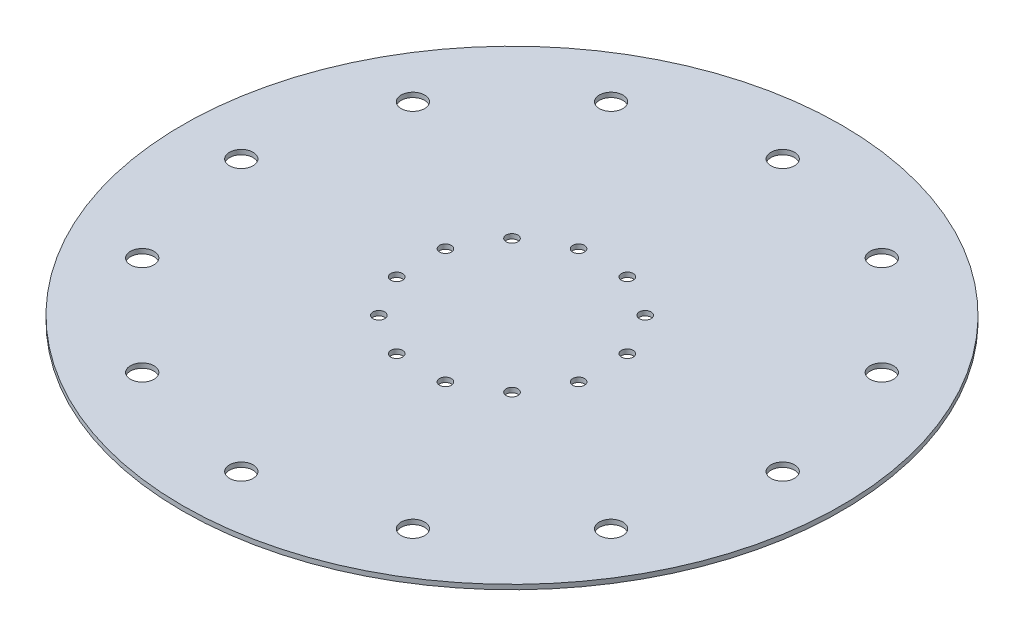
ISO-10303-21;
HEADER;
FILE_DESCRIPTION(('STEP AP214'),'2;1');
FILE_NAME('part.step','',(''),(''),'','','');
FILE_SCHEMA(('AUTOMOTIVE_DESIGN { 1 0 10303 214 1 1 1 1 }'));
ENDSEC;
DATA;
#1=APPLICATION_CONTEXT('core data for automotive mechanical design processes');
#2=APPLICATION_PROTOCOL_DEFINITION('international standard','automotive_design',2000,#1);
#3=PRODUCT_CONTEXT('',#1,'mechanical');
#4=PRODUCT('Part','Part','',(#3));
#5=PRODUCT_RELATED_PRODUCT_CATEGORY('part','',(#4));
#6=PRODUCT_DEFINITION_FORMATION('','',#4);
#7=PRODUCT_DEFINITION_CONTEXT('part definition',#1,'design');
#8=PRODUCT_DEFINITION('design','',#6,#7);
#9=PRODUCT_DEFINITION_SHAPE('','',#8);
#10=(LENGTH_UNIT() NAMED_UNIT(*) SI_UNIT(.MILLI.,.METRE.));
#11=(NAMED_UNIT(*) PLANE_ANGLE_UNIT() SI_UNIT($,.RADIAN.));
#12=(NAMED_UNIT(*) SI_UNIT($,.STERADIAN.) SOLID_ANGLE_UNIT());
#13=UNCERTAINTY_MEASURE_WITH_UNIT(LENGTH_MEASURE(1.E-05),#10,'distance_accuracy_value','');
#14=(GEOMETRIC_REPRESENTATION_CONTEXT(3) GLOBAL_UNCERTAINTY_ASSIGNED_CONTEXT((#13)) GLOBAL_UNIT_ASSIGNED_CONTEXT((#10,
#11,#12)) REPRESENTATION_CONTEXT('',''));
#15=CARTESIAN_POINT('',(0.,0.,0.));
#16=DIRECTION('',(0.,0.,1.));
#17=DIRECTION('',(1.,0.,0.));
#18=AXIS2_PLACEMENT_3D('',#15,#16,#17);
#19=CARTESIAN_POINT('',(0.,2.,0.));
#20=DIRECTION('',(0.,1.,0.));
#21=DIRECTION('',(0.,0.,1.));
#22=AXIS2_PLACEMENT_3D('',#19,#20,#21);
#23=PLANE('',#22);
#24=CARTESIAN_POINT('',(10.3527618041007,2.,38.6370330515628));
#25=DIRECTION('',(0.,1.,0.));
#26=DIRECTION('',(0.,0.,1.));
#27=AXIS2_PLACEMENT_3D('',#24,#25,#26);
#28=CIRCLE('',#27,2.5);
#29=CARTESIAN_POINT('',(10.3527618041007,2.,41.1370330515628));
#30=VERTEX_POINT('',#29);
#31=EDGE_CURVE('E177',#30,#30,#28,.T.);
#32=ORIENTED_EDGE('',*,*,#31,.F.);
#33=EDGE_LOOP('',(#32));
#34=FACE_BOUND('',#33,.T.);
#35=CARTESIAN_POINT('',(28.2842712474621,2.,28.2842712474617));
#36=DIRECTION('',(0.,1.,0.));
#37=DIRECTION('',(0.,0.,1.));
#38=AXIS2_PLACEMENT_3D('',#35,#36,#37);
#39=CIRCLE('',#38,2.50000000000001);
#40=CARTESIAN_POINT('',(28.2842712474621,2.,30.7842712474617));
#41=VERTEX_POINT('',#40);
#42=EDGE_CURVE('E165',#41,#41,#39,.T.);
#43=ORIENTED_EDGE('',*,*,#42,.F.);
#44=EDGE_LOOP('',(#43));
#45=FACE_BOUND('',#44,.T.);
#46=CARTESIAN_POINT('',(28.2842712474621,2.,-28.2842712474617));
#47=DIRECTION('',(0.,1.,0.));
#48=DIRECTION('',(0.,0.,-1.));
#49=AXIS2_PLACEMENT_3D('',#46,#47,#48);
#50=CIRCLE('',#49,2.50000000000001);
#51=CARTESIAN_POINT('',(28.2842712474621,2.,-30.7842712474617));
#52=VERTEX_POINT('',#51);
#53=EDGE_CURVE('E153',#52,#52,#50,.T.);
#54=ORIENTED_EDGE('',*,*,#53,.F.);
#55=EDGE_LOOP('',(#54));
#56=FACE_BOUND('',#55,.T.);
#57=CARTESIAN_POINT('',(38.6370330515627,2.,-10.3527618041009));
#58=DIRECTION('',(0.,1.,0.));
#59=DIRECTION('',(0.,0.,-1.));
#60=AXIS2_PLACEMENT_3D('',#57,#58,#59);
#61=CIRCLE('',#60,2.5);
#62=CARTESIAN_POINT('',(38.6370330515627,2.,-12.8527618041009));
#63=VERTEX_POINT('',#62);
#64=EDGE_CURVE('E141',#63,#63,#61,.T.);
#65=ORIENTED_EDGE('',*,*,#64,.F.);
#66=EDGE_LOOP('',(#65));
#67=FACE_BOUND('',#66,.T.);
#68=CARTESIAN_POINT('',(-115.,2.,0.));
#69=DIRECTION('',(0.,1.,0.));
#70=DIRECTION('',(0.,0.,1.));
#71=AXIS2_PLACEMENT_3D('',#68,#69,#70);
#72=CIRCLE('',#71,5.);
#73=CARTESIAN_POINT('',(-115.,2.,5.));
#74=VERTEX_POINT('',#73);
#75=EDGE_CURVE('E129',#74,#74,#72,.T.);
#76=ORIENTED_EDGE('',*,*,#75,.F.);
#77=EDGE_LOOP('',(#76));
#78=FACE_BOUND('',#77,.T.);
#79=CARTESIAN_POINT('',(-38.6370330515627,2.,10.3527618041009));
#80=DIRECTION('',(0.,1.,0.));
#81=DIRECTION('',(0.,0.,1.));
#82=AXIS2_PLACEMENT_3D('',#79,#80,#81);
#83=CIRCLE('',#82,2.49999999999999);
#84=CARTESIAN_POINT('',(-38.6370330515627,2.,12.8527618041009));
#85=VERTEX_POINT('',#84);
#86=EDGE_CURVE('E117',#85,#85,#83,.T.);
#87=ORIENTED_EDGE('',*,*,#86,.F.);
#88=EDGE_LOOP('',(#87));
#89=FACE_BOUND('',#88,.T.);
#90=CARTESIAN_POINT('',(0.,2.,-115.));
#91=DIRECTION('',(0.,1.,0.));
#92=DIRECTION('',(0.,0.,1.));
#93=AXIS2_PLACEMENT_3D('',#90,#91,#92);
#94=CIRCLE('',#93,5.);
#95=CARTESIAN_POINT('',(0.,2.,-110.));
#96=VERTEX_POINT('',#95);
#97=EDGE_CURVE('E105',#96,#96,#94,.T.);
#98=ORIENTED_EDGE('',*,*,#97,.F.);
#99=EDGE_LOOP('',(#98));
#100=FACE_BOUND('',#99,.T.);
#101=CARTESIAN_POINT('',(-57.4999999999995,2.,99.5929214352107));
#102=DIRECTION('',(0.,1.,0.));
#103=DIRECTION('',(0.,0.,-1.));
#104=AXIS2_PLACEMENT_3D('',#101,#102,#103);
#105=CIRCLE('',#104,4.99999999999994);
#106=CARTESIAN_POINT('',(-57.4999999999995,2.,94.5929214352108));
#107=VERTEX_POINT('',#106);
#108=EDGE_CURVE('E93',#107,#107,#105,.T.);
#109=ORIENTED_EDGE('',*,*,#108,.F.);
#110=EDGE_LOOP('',(#109));
#111=FACE_BOUND('',#110,.T.);
#112=CARTESIAN_POINT('',(99.5929214352104,2.,57.5000000000001));
#113=DIRECTION('',(0.,1.,0.));
#114=DIRECTION('',(0.,0.,1.));
#115=AXIS2_PLACEMENT_3D('',#112,#113,#114);
#116=CIRCLE('',#115,5.00000000000003);
#117=CARTESIAN_POINT('',(99.5929214352104,2.,62.5000000000002));
#118=VERTEX_POINT('',#117);
#119=EDGE_CURVE('E81',#118,#118,#116,.T.);
#120=ORIENTED_EDGE('',*,*,#119,.F.);
#121=EDGE_LOOP('',(#120));
#122=FACE_BOUND('',#121,.T.);
#123=CARTESIAN_POINT('',(-10.3527618041007,2.,-38.6370330515628));
#124=DIRECTION('',(0.,1.,0.));
#125=DIRECTION('',(0.,0.,1.));
#126=AXIS2_PLACEMENT_3D('',#123,#124,#125);
#127=CIRCLE('',#126,2.5);
#128=CARTESIAN_POINT('',(-10.3527618041007,2.,-36.1370330515628));
#129=VERTEX_POINT('',#128);
#130=EDGE_CURVE('E69',#129,#129,#127,.T.);
#131=ORIENTED_EDGE('',*,*,#130,.F.);
#132=EDGE_LOOP('',(#131));
#133=FACE_BOUND('',#132,.T.);
#134=CARTESIAN_POINT('',(57.4999999999995,2.,-99.5929214352107));
#135=DIRECTION('',(0.,1.,0.));
#136=DIRECTION('',(0.,0.,-1.));
#137=AXIS2_PLACEMENT_3D('',#134,#135,#136);
#138=CIRCLE('',#137,5.00000000000001);
#139=CARTESIAN_POINT('',(57.4999999999995,2.,-104.592921435211));
#140=VERTEX_POINT('',#139);
#141=EDGE_CURVE('E57',#140,#140,#138,.T.);
#142=ORIENTED_EDGE('',*,*,#141,.F.);
#143=EDGE_LOOP('',(#142));
#144=FACE_BOUND('',#143,.T.);
#145=CARTESIAN_POINT('',(-99.5929214352104,2.,-57.5000000000001));
#146=DIRECTION('',(0.,1.,0.));
#147=DIRECTION('',(0.,0.,1.));
#148=AXIS2_PLACEMENT_3D('',#145,#146,#147);
#149=CIRCLE('',#148,4.99999999999992);
#150=CARTESIAN_POINT('',(-99.5929214352104,2.,-52.5000000000002));
#151=VERTEX_POINT('',#150);
#152=EDGE_CURVE('E46',#151,#151,#149,.T.);
#153=ORIENTED_EDGE('',*,*,#152,.F.);
#154=EDGE_LOOP('',(#153));
#155=FACE_BOUND('',#154,.T.);
#156=CARTESIAN_POINT('',(0.,2.,0.));
#157=DIRECTION('',(0.,1.,0.));
#158=DIRECTION('',(0.,0.,1.));
#159=AXIS2_PLACEMENT_3D('',#156,#157,#158);
#160=CIRCLE('',#159,140.);
#161=CARTESIAN_POINT('',(0.,2.,140.));
#162=VERTEX_POINT('',#161);
#163=EDGE_CURVE('E10',#162,#162,#160,.T.);
#164=ORIENTED_EDGE('',*,*,#163,.T.);
#165=EDGE_LOOP('',(#164));
#166=FACE_BOUND('',#165,.T.);
#167=CARTESIAN_POINT('',(-57.4999999999994,2.,-99.5929214352108));
#168=DIRECTION('',(0.,1.,0.));
#169=DIRECTION('',(0.,0.,1.));
#170=AXIS2_PLACEMENT_3D('',#167,#168,#169);
#171=CIRCLE('',#170,4.99999999999983);
#172=CARTESIAN_POINT('',(-57.4999999999994,2.,-94.5929214352109));
#173=VERTEX_POINT('',#172);
#174=EDGE_CURVE('E51',#173,#173,#171,.T.);
#175=ORIENTED_EDGE('',*,*,#174,.F.);
#176=EDGE_LOOP('',(#175));
#177=FACE_BOUND('',#176,.T.);
#178=CARTESIAN_POINT('',(99.5929214352104,2.,-57.5000000000001));
#179=DIRECTION('',(0.,1.,0.));
#180=DIRECTION('',(0.,0.,-1.));
#181=AXIS2_PLACEMENT_3D('',#178,#179,#180);
#182=CIRCLE('',#181,5.00000000000003);
#183=CARTESIAN_POINT('',(99.5929214352104,2.,-62.5000000000002));
#184=VERTEX_POINT('',#183);
#185=EDGE_CURVE('E63',#184,#184,#182,.T.);
#186=ORIENTED_EDGE('',*,*,#185,.F.);
#187=EDGE_LOOP('',(#186));
#188=FACE_BOUND('',#187,.T.);
#189=CARTESIAN_POINT('',(-28.2842712474621,2.,-28.2842712474617));
#190=DIRECTION('',(0.,1.,0.));
#191=DIRECTION('',(0.,0.,1.));
#192=AXIS2_PLACEMENT_3D('',#189,#190,#191);
#193=CIRCLE('',#192,2.5);
#194=CARTESIAN_POINT('',(-28.2842712474621,2.,-25.7842712474617));
#195=VERTEX_POINT('',#194);
#196=EDGE_CURVE('E75',#195,#195,#193,.T.);
#197=ORIENTED_EDGE('',*,*,#196,.F.);
#198=EDGE_LOOP('',(#197));
#199=FACE_BOUND('',#198,.T.);
#200=CARTESIAN_POINT('',(57.4999999999995,2.,99.5929214352107));
#201=DIRECTION('',(0.,1.,0.));
#202=DIRECTION('',(0.,0.,1.));
#203=AXIS2_PLACEMENT_3D('',#200,#201,#202);
#204=CIRCLE('',#203,5.00000000000001);
#205=CARTESIAN_POINT('',(57.4999999999995,2.,104.592921435211));
#206=VERTEX_POINT('',#205);
#207=EDGE_CURVE('E87',#206,#206,#204,.T.);
#208=ORIENTED_EDGE('',*,*,#207,.F.);
#209=EDGE_LOOP('',(#208));
#210=FACE_BOUND('',#209,.T.);
#211=CARTESIAN_POINT('',(-99.5929214352104,2.,57.5000000000001));
#212=DIRECTION('',(0.,1.,0.));
#213=DIRECTION('',(0.,0.,-1.));
#214=AXIS2_PLACEMENT_3D('',#211,#212,#213);
#215=CIRCLE('',#214,5.00000000000001);
#216=CARTESIAN_POINT('',(-99.5929214352104,2.,52.5000000000001));
#217=VERTEX_POINT('',#216);
#218=EDGE_CURVE('E99',#217,#217,#215,.T.);
#219=ORIENTED_EDGE('',*,*,#218,.F.);
#220=EDGE_LOOP('',(#219));
#221=FACE_BOUND('',#220,.T.);
#222=CARTESIAN_POINT('',(-38.6370330515627,2.,-10.3527618041009));
#223=DIRECTION('',(0.,1.,0.));
#224=DIRECTION('',(0.,0.,1.));
#225=AXIS2_PLACEMENT_3D('',#222,#223,#224);
#226=CIRCLE('',#225,2.5);
#227=CARTESIAN_POINT('',(-38.6370330515627,2.,-7.85276180410085));
#228=VERTEX_POINT('',#227);
#229=EDGE_CURVE('E111',#228,#228,#226,.T.);
#230=ORIENTED_EDGE('',*,*,#229,.F.);
#231=EDGE_LOOP('',(#230));
#232=FACE_BOUND('',#231,.T.);
#233=CARTESIAN_POINT('',(0.,2.,115.));
#234=DIRECTION('',(0.,1.,0.));
#235=DIRECTION('',(0.,0.,-1.));
#236=AXIS2_PLACEMENT_3D('',#233,#234,#235);
#237=CIRCLE('',#236,5.);
#238=CARTESIAN_POINT('',(0.,2.,110.));
#239=VERTEX_POINT('',#238);
#240=EDGE_CURVE('E123',#239,#239,#237,.T.);
#241=ORIENTED_EDGE('',*,*,#240,.F.);
#242=EDGE_LOOP('',(#241));
#243=FACE_BOUND('',#242,.T.);
#244=CARTESIAN_POINT('',(38.6370330515627,2.,10.3527618041009));
#245=DIRECTION('',(0.,1.,0.));
#246=DIRECTION('',(0.,0.,-1.));
#247=AXIS2_PLACEMENT_3D('',#244,#245,#246);
#248=CIRCLE('',#247,2.5);
#249=CARTESIAN_POINT('',(38.6370330515627,2.,7.85276180410085));
#250=VERTEX_POINT('',#249);
#251=EDGE_CURVE('E135',#250,#250,#248,.T.);
#252=ORIENTED_EDGE('',*,*,#251,.F.);
#253=EDGE_LOOP('',(#252));
#254=FACE_BOUND('',#253,.T.);
#255=CARTESIAN_POINT('',(115.,2.,0.));
#256=DIRECTION('',(0.,1.,0.));
#257=DIRECTION('',(0.,0.,-1.));
#258=AXIS2_PLACEMENT_3D('',#255,#256,#257);
#259=CIRCLE('',#258,5.00000000000003);
#260=CARTESIAN_POINT('',(115.,2.,-5.00000000000003));
#261=VERTEX_POINT('',#260);
#262=EDGE_CURVE('E147',#261,#261,#259,.T.);
#263=ORIENTED_EDGE('',*,*,#262,.F.);
#264=EDGE_LOOP('',(#263));
#265=FACE_BOUND('',#264,.T.);
#266=CARTESIAN_POINT('',(10.3527618041007,2.,-38.6370330515628));
#267=DIRECTION('',(0.,1.,0.));
#268=DIRECTION('',(0.,0.,-1.));
#269=AXIS2_PLACEMENT_3D('',#266,#267,#268);
#270=CIRCLE('',#269,2.5);
#271=CARTESIAN_POINT('',(10.3527618041007,2.,-41.1370330515628));
#272=VERTEX_POINT('',#271);
#273=EDGE_CURVE('E159',#272,#272,#270,.T.);
#274=ORIENTED_EDGE('',*,*,#273,.F.);
#275=EDGE_LOOP('',(#274));
#276=FACE_BOUND('',#275,.T.);
#277=CARTESIAN_POINT('',(-28.2842712474621,2.,28.2842712474617));
#278=DIRECTION('',(0.,1.,0.));
#279=DIRECTION('',(0.,0.,-1.));
#280=AXIS2_PLACEMENT_3D('',#277,#278,#279);
#281=CIRCLE('',#280,2.5);
#282=CARTESIAN_POINT('',(-28.2842712474621,2.,25.7842712474617));
#283=VERTEX_POINT('',#282);
#284=EDGE_CURVE('E171',#283,#283,#281,.T.);
#285=ORIENTED_EDGE('',*,*,#284,.F.);
#286=EDGE_LOOP('',(#285));
#287=FACE_BOUND('',#286,.T.);
#288=CARTESIAN_POINT('',(-10.3527618041007,2.,38.6370330515628));
#289=DIRECTION('',(0.,1.,0.));
#290=DIRECTION('',(0.,0.,-1.));
#291=AXIS2_PLACEMENT_3D('',#288,#289,#290);
#292=CIRCLE('',#291,2.5);
#293=CARTESIAN_POINT('',(-10.3527618041007,2.,36.1370330515628));
#294=VERTEX_POINT('',#293);
#295=EDGE_CURVE('E183',#294,#294,#292,.T.);
#296=ORIENTED_EDGE('',*,*,#295,.F.);
#297=EDGE_LOOP('',(#296));
#298=FACE_BOUND('',#297,.T.);
#299=ADVANCED_FACE('F35',(#34,#45,#56,#67,#78,#89,#100,#111,#122,#133,#144,#155,#166,#177,#188,
#199,#210,#221,#232,#243,#254,#265,#276,#287,#298),#23,.T.);
#300=CARTESIAN_POINT('',(0.,0.,0.));
#301=DIRECTION('',(0.,1.,0.));
#302=DIRECTION('',(0.,0.,1.));
#303=AXIS2_PLACEMENT_3D('',#300,#301,#302);
#304=PLANE('',#303);
#305=CARTESIAN_POINT('',(0.,0.,0.));
#306=DIRECTION('',(0.,1.,0.));
#307=DIRECTION('',(0.,0.,1.));
#308=AXIS2_PLACEMENT_3D('',#305,#306,#307);
#309=CIRCLE('',#308,140.);
#310=CARTESIAN_POINT('',(0.,0.,140.));
#311=VERTEX_POINT('',#310);
#312=EDGE_CURVE('E39',#311,#311,#309,.T.);
#313=ORIENTED_EDGE('',*,*,#312,.F.);
#314=EDGE_LOOP('',(#313));
#315=FACE_BOUND('',#314,.T.);
#316=CARTESIAN_POINT('',(-99.5929214352104,0.,-57.5000000000001));
#317=DIRECTION('',(0.,1.,0.));
#318=DIRECTION('',(0.,0.,1.));
#319=AXIS2_PLACEMENT_3D('',#316,#317,#318);
#320=CIRCLE('',#319,4.99999999999992);
#321=CARTESIAN_POINT('',(-99.5929214352104,0.,-52.5000000000002));
#322=VERTEX_POINT('',#321);
#323=EDGE_CURVE('E48',#322,#322,#320,.T.);
#324=ORIENTED_EDGE('',*,*,#323,.T.);
#325=EDGE_LOOP('',(#324));
#326=FACE_BOUND('',#325,.T.);
#327=CARTESIAN_POINT('',(-57.4999999999994,0.,-99.5929214352108));
#328=DIRECTION('',(0.,1.,0.));
#329=DIRECTION('',(0.,0.,1.));
#330=AXIS2_PLACEMENT_3D('',#327,#328,#329);
#331=CIRCLE('',#330,4.99999999999983);
#332=CARTESIAN_POINT('',(-57.4999999999994,0.,-94.5929214352109));
#333=VERTEX_POINT('',#332);
#334=EDGE_CURVE('E54',#333,#333,#331,.T.);
#335=ORIENTED_EDGE('',*,*,#334,.T.);
#336=EDGE_LOOP('',(#335));
#337=FACE_BOUND('',#336,.T.);
#338=CARTESIAN_POINT('',(57.4999999999995,0.,-99.5929214352107));
#339=DIRECTION('',(0.,1.,0.));
#340=DIRECTION('',(0.,0.,-1.));
#341=AXIS2_PLACEMENT_3D('',#338,#339,#340);
#342=CIRCLE('',#341,5.00000000000001);
#343=CARTESIAN_POINT('',(57.4999999999995,0.,-104.592921435211));
#344=VERTEX_POINT('',#343);
#345=EDGE_CURVE('E60',#344,#344,#342,.T.);
#346=ORIENTED_EDGE('',*,*,#345,.T.);
#347=EDGE_LOOP('',(#346));
#348=FACE_BOUND('',#347,.T.);
#349=CARTESIAN_POINT('',(99.5929214352104,0.,-57.5000000000001));
#350=DIRECTION('',(0.,1.,0.));
#351=DIRECTION('',(0.,0.,-1.));
#352=AXIS2_PLACEMENT_3D('',#349,#350,#351);
#353=CIRCLE('',#352,5.00000000000003);
#354=CARTESIAN_POINT('',(99.5929214352104,0.,-62.5000000000002));
#355=VERTEX_POINT('',#354);
#356=EDGE_CURVE('E66',#355,#355,#353,.T.);
#357=ORIENTED_EDGE('',*,*,#356,.T.);
#358=EDGE_LOOP('',(#357));
#359=FACE_BOUND('',#358,.T.);
#360=CARTESIAN_POINT('',(-10.3527618041007,0.,-38.6370330515628));
#361=DIRECTION('',(0.,1.,0.));
#362=DIRECTION('',(0.,0.,1.));
#363=AXIS2_PLACEMENT_3D('',#360,#361,#362);
#364=CIRCLE('',#363,2.5);
#365=CARTESIAN_POINT('',(-10.3527618041007,0.,-36.1370330515628));
#366=VERTEX_POINT('',#365);
#367=EDGE_CURVE('E72',#366,#366,#364,.T.);
#368=ORIENTED_EDGE('',*,*,#367,.T.);
#369=EDGE_LOOP('',(#368));
#370=FACE_BOUND('',#369,.T.);
#371=CARTESIAN_POINT('',(-28.2842712474621,0.,-28.2842712474617));
#372=DIRECTION('',(0.,1.,0.));
#373=DIRECTION('',(0.,0.,1.));
#374=AXIS2_PLACEMENT_3D('',#371,#372,#373);
#375=CIRCLE('',#374,2.5);
#376=CARTESIAN_POINT('',(-28.2842712474621,0.,-25.7842712474617));
#377=VERTEX_POINT('',#376);
#378=EDGE_CURVE('E78',#377,#377,#375,.T.);
#379=ORIENTED_EDGE('',*,*,#378,.T.);
#380=EDGE_LOOP('',(#379));
#381=FACE_BOUND('',#380,.T.);
#382=CARTESIAN_POINT('',(99.5929214352104,0.,57.5000000000001));
#383=DIRECTION('',(0.,1.,0.));
#384=DIRECTION('',(0.,0.,1.));
#385=AXIS2_PLACEMENT_3D('',#382,#383,#384);
#386=CIRCLE('',#385,5.00000000000003);
#387=CARTESIAN_POINT('',(99.5929214352104,0.,62.5000000000002));
#388=VERTEX_POINT('',#387);
#389=EDGE_CURVE('E84',#388,#388,#386,.T.);
#390=ORIENTED_EDGE('',*,*,#389,.T.);
#391=EDGE_LOOP('',(#390));
#392=FACE_BOUND('',#391,.T.);
#393=CARTESIAN_POINT('',(57.4999999999995,0.,99.5929214352107));
#394=DIRECTION('',(0.,1.,0.));
#395=DIRECTION('',(0.,0.,1.));
#396=AXIS2_PLACEMENT_3D('',#393,#394,#395);
#397=CIRCLE('',#396,5.00000000000001);
#398=CARTESIAN_POINT('',(57.4999999999995,0.,104.592921435211));
#399=VERTEX_POINT('',#398);
#400=EDGE_CURVE('E90',#399,#399,#397,.T.);
#401=ORIENTED_EDGE('',*,*,#400,.T.);
#402=EDGE_LOOP('',(#401));
#403=FACE_BOUND('',#402,.T.);
#404=CARTESIAN_POINT('',(-57.4999999999995,0.,99.5929214352107));
#405=DIRECTION('',(0.,1.,0.));
#406=DIRECTION('',(0.,0.,-1.));
#407=AXIS2_PLACEMENT_3D('',#404,#405,#406);
#408=CIRCLE('',#407,4.99999999999994);
#409=CARTESIAN_POINT('',(-57.4999999999995,0.,94.5929214352108));
#410=VERTEX_POINT('',#409);
#411=EDGE_CURVE('E96',#410,#410,#408,.T.);
#412=ORIENTED_EDGE('',*,*,#411,.T.);
#413=EDGE_LOOP('',(#412));
#414=FACE_BOUND('',#413,.T.);
#415=CARTESIAN_POINT('',(-99.5929214352104,0.,57.5000000000001));
#416=DIRECTION('',(0.,1.,0.));
#417=DIRECTION('',(0.,0.,-1.));
#418=AXIS2_PLACEMENT_3D('',#415,#416,#417);
#419=CIRCLE('',#418,5.00000000000001);
#420=CARTESIAN_POINT('',(-99.5929214352104,0.,52.5000000000001));
#421=VERTEX_POINT('',#420);
#422=EDGE_CURVE('E102',#421,#421,#419,.T.);
#423=ORIENTED_EDGE('',*,*,#422,.T.);
#424=EDGE_LOOP('',(#423));
#425=FACE_BOUND('',#424,.T.);
#426=CARTESIAN_POINT('',(0.,0.,-115.));
#427=DIRECTION('',(0.,1.,0.));
#428=DIRECTION('',(0.,0.,1.));
#429=AXIS2_PLACEMENT_3D('',#426,#427,#428);
#430=CIRCLE('',#429,5.);
#431=CARTESIAN_POINT('',(0.,0.,-110.));
#432=VERTEX_POINT('',#431);
#433=EDGE_CURVE('E108',#432,#432,#430,.T.);
#434=ORIENTED_EDGE('',*,*,#433,.T.);
#435=EDGE_LOOP('',(#434));
#436=FACE_BOUND('',#435,.T.);
#437=CARTESIAN_POINT('',(-38.6370330515627,0.,-10.3527618041009));
#438=DIRECTION('',(0.,1.,0.));
#439=DIRECTION('',(0.,0.,1.));
#440=AXIS2_PLACEMENT_3D('',#437,#438,#439);
#441=CIRCLE('',#440,2.5);
#442=CARTESIAN_POINT('',(-38.6370330515627,0.,-7.85276180410085));
#443=VERTEX_POINT('',#442);
#444=EDGE_CURVE('E114',#443,#443,#441,.T.);
#445=ORIENTED_EDGE('',*,*,#444,.T.);
#446=EDGE_LOOP('',(#445));
#447=FACE_BOUND('',#446,.T.);
#448=CARTESIAN_POINT('',(-38.6370330515627,0.,10.3527618041009));
#449=DIRECTION('',(0.,1.,0.));
#450=DIRECTION('',(0.,0.,1.));
#451=AXIS2_PLACEMENT_3D('',#448,#449,#450);
#452=CIRCLE('',#451,2.49999999999999);
#453=CARTESIAN_POINT('',(-38.6370330515627,0.,12.8527618041009));
#454=VERTEX_POINT('',#453);
#455=EDGE_CURVE('E120',#454,#454,#452,.T.);
#456=ORIENTED_EDGE('',*,*,#455,.T.);
#457=EDGE_LOOP('',(#456));
#458=FACE_BOUND('',#457,.T.);
#459=CARTESIAN_POINT('',(0.,0.,115.));
#460=DIRECTION('',(0.,1.,0.));
#461=DIRECTION('',(0.,0.,-1.));
#462=AXIS2_PLACEMENT_3D('',#459,#460,#461);
#463=CIRCLE('',#462,5.);
#464=CARTESIAN_POINT('',(0.,0.,110.));
#465=VERTEX_POINT('',#464);
#466=EDGE_CURVE('E126',#465,#465,#463,.T.);
#467=ORIENTED_EDGE('',*,*,#466,.T.);
#468=EDGE_LOOP('',(#467));
#469=FACE_BOUND('',#468,.T.);
#470=CARTESIAN_POINT('',(-115.,0.,0.));
#471=DIRECTION('',(0.,1.,0.));
#472=DIRECTION('',(0.,0.,1.));
#473=AXIS2_PLACEMENT_3D('',#470,#471,#472);
#474=CIRCLE('',#473,5.);
#475=CARTESIAN_POINT('',(-115.,0.,5.));
#476=VERTEX_POINT('',#475);
#477=EDGE_CURVE('E132',#476,#476,#474,.T.);
#478=ORIENTED_EDGE('',*,*,#477,.T.);
#479=EDGE_LOOP('',(#478));
#480=FACE_BOUND('',#479,.T.);
#481=CARTESIAN_POINT('',(38.6370330515627,0.,10.3527618041009));
#482=DIRECTION('',(0.,1.,0.));
#483=DIRECTION('',(0.,0.,-1.));
#484=AXIS2_PLACEMENT_3D('',#481,#482,#483);
#485=CIRCLE('',#484,2.5);
#486=CARTESIAN_POINT('',(38.6370330515627,0.,7.85276180410085));
#487=VERTEX_POINT('',#486);
#488=EDGE_CURVE('E138',#487,#487,#485,.T.);
#489=ORIENTED_EDGE('',*,*,#488,.T.);
#490=EDGE_LOOP('',(#489));
#491=FACE_BOUND('',#490,.T.);
#492=CARTESIAN_POINT('',(38.6370330515627,0.,-10.3527618041009));
#493=DIRECTION('',(0.,1.,0.));
#494=DIRECTION('',(0.,0.,-1.));
#495=AXIS2_PLACEMENT_3D('',#492,#493,#494);
#496=CIRCLE('',#495,2.5);
#497=CARTESIAN_POINT('',(38.6370330515627,0.,-12.8527618041009));
#498=VERTEX_POINT('',#497);
#499=EDGE_CURVE('E144',#498,#498,#496,.T.);
#500=ORIENTED_EDGE('',*,*,#499,.T.);
#501=EDGE_LOOP('',(#500));
#502=FACE_BOUND('',#501,.T.);
#503=CARTESIAN_POINT('',(115.,0.,0.));
#504=DIRECTION('',(0.,1.,0.));
#505=DIRECTION('',(0.,0.,-1.));
#506=AXIS2_PLACEMENT_3D('',#503,#504,#505);
#507=CIRCLE('',#506,5.00000000000003);
#508=CARTESIAN_POINT('',(115.,0.,-5.00000000000003));
#509=VERTEX_POINT('',#508);
#510=EDGE_CURVE('E150',#509,#509,#507,.T.);
#511=ORIENTED_EDGE('',*,*,#510,.T.);
#512=EDGE_LOOP('',(#511));
#513=FACE_BOUND('',#512,.T.);
#514=CARTESIAN_POINT('',(28.2842712474621,0.,-28.2842712474617));
#515=DIRECTION('',(0.,1.,0.));
#516=DIRECTION('',(0.,0.,-1.));
#517=AXIS2_PLACEMENT_3D('',#514,#515,#516);
#518=CIRCLE('',#517,2.50000000000001);
#519=CARTESIAN_POINT('',(28.2842712474621,0.,-30.7842712474617));
#520=VERTEX_POINT('',#519);
#521=EDGE_CURVE('E156',#520,#520,#518,.T.);
#522=ORIENTED_EDGE('',*,*,#521,.T.);
#523=EDGE_LOOP('',(#522));
#524=FACE_BOUND('',#523,.T.);
#525=CARTESIAN_POINT('',(10.3527618041007,0.,-38.6370330515628));
#526=DIRECTION('',(0.,1.,0.));
#527=DIRECTION('',(0.,0.,-1.));
#528=AXIS2_PLACEMENT_3D('',#525,#526,#527);
#529=CIRCLE('',#528,2.5);
#530=CARTESIAN_POINT('',(10.3527618041007,0.,-41.1370330515628));
#531=VERTEX_POINT('',#530);
#532=EDGE_CURVE('E162',#531,#531,#529,.T.);
#533=ORIENTED_EDGE('',*,*,#532,.T.);
#534=EDGE_LOOP('',(#533));
#535=FACE_BOUND('',#534,.T.);
#536=CARTESIAN_POINT('',(28.2842712474621,0.,28.2842712474617));
#537=DIRECTION('',(0.,1.,0.));
#538=DIRECTION('',(0.,0.,1.));
#539=AXIS2_PLACEMENT_3D('',#536,#537,#538);
#540=CIRCLE('',#539,2.50000000000001);
#541=CARTESIAN_POINT('',(28.2842712474621,0.,30.7842712474617));
#542=VERTEX_POINT('',#541);
#543=EDGE_CURVE('E168',#542,#542,#540,.T.);
#544=ORIENTED_EDGE('',*,*,#543,.T.);
#545=EDGE_LOOP('',(#544));
#546=FACE_BOUND('',#545,.T.);
#547=CARTESIAN_POINT('',(-28.2842712474621,0.,28.2842712474617));
#548=DIRECTION('',(0.,1.,0.));
#549=DIRECTION('',(0.,0.,-1.));
#550=AXIS2_PLACEMENT_3D('',#547,#548,#549);
#551=CIRCLE('',#550,2.5);
#552=CARTESIAN_POINT('',(-28.2842712474621,0.,25.7842712474617));
#553=VERTEX_POINT('',#552);
#554=EDGE_CURVE('E174',#553,#553,#551,.T.);
#555=ORIENTED_EDGE('',*,*,#554,.T.);
#556=EDGE_LOOP('',(#555));
#557=FACE_BOUND('',#556,.T.);
#558=CARTESIAN_POINT('',(10.3527618041007,0.,38.6370330515628));
#559=DIRECTION('',(0.,1.,0.));
#560=DIRECTION('',(0.,0.,1.));
#561=AXIS2_PLACEMENT_3D('',#558,#559,#560);
#562=CIRCLE('',#561,2.5);
#563=CARTESIAN_POINT('',(10.3527618041007,0.,41.1370330515628));
#564=VERTEX_POINT('',#563);
#565=EDGE_CURVE('E180',#564,#564,#562,.T.);
#566=ORIENTED_EDGE('',*,*,#565,.T.);
#567=EDGE_LOOP('',(#566));
#568=FACE_BOUND('',#567,.T.);
#569=CARTESIAN_POINT('',(-10.3527618041007,0.,38.6370330515628));
#570=DIRECTION('',(0.,1.,0.));
#571=DIRECTION('',(0.,0.,-1.));
#572=AXIS2_PLACEMENT_3D('',#569,#570,#571);
#573=CIRCLE('',#572,2.5);
#574=CARTESIAN_POINT('',(-10.3527618041007,0.,36.1370330515628));
#575=VERTEX_POINT('',#574);
#576=EDGE_CURVE('E186',#575,#575,#573,.T.);
#577=ORIENTED_EDGE('',*,*,#576,.T.);
#578=EDGE_LOOP('',(#577));
#579=FACE_BOUND('',#578,.T.);
#580=ADVANCED_FACE('F196',(#315,#326,#337,#348,#359,#370,#381,#392,#403,#414,#425,#436,#447,
#458,#469,#480,#491,#502,#513,#524,#535,#546,#557,#568,#579),#304,.F.);
#581=CARTESIAN_POINT('',(0.,2.,0.));
#582=DIRECTION('',(0.,-1.,0.));
#583=DIRECTION('',(0.,0.,-1.));
#584=AXIS2_PLACEMENT_3D('',#581,#582,#583);
#585=CYLINDRICAL_SURFACE('',#584,140.);
#586=ORIENTED_EDGE('',*,*,#163,.F.);
#587=EDGE_LOOP('',(#586));
#588=FACE_BOUND('',#587,.T.);
#589=ORIENTED_EDGE('',*,*,#312,.T.);
#590=EDGE_LOOP('',(#589));
#591=FACE_BOUND('',#590,.T.);
#592=ADVANCED_FACE('F37',(#588,#591),#585,.T.);
#593=CARTESIAN_POINT('',(-99.5929214352104,2.,-57.5000000000001));
#594=DIRECTION('',(0.,-1.,0.));
#595=DIRECTION('',(0.,0.,-1.));
#596=AXIS2_PLACEMENT_3D('',#593,#594,#595);
#597=CYLINDRICAL_SURFACE('',#596,4.99999999999992);
#598=ORIENTED_EDGE('',*,*,#152,.T.);
#599=EDGE_LOOP('',(#598));
#600=FACE_BOUND('',#599,.T.);
#601=ORIENTED_EDGE('',*,*,#323,.F.);
#602=EDGE_LOOP('',(#601));
#603=FACE_BOUND('',#602,.T.);
#604=ADVANCED_FACE('F206',(#600,#603),#597,.F.);
#605=CARTESIAN_POINT('',(-57.4999999999994,2.,-99.5929214352108));
#606=DIRECTION('',(0.,-1.,0.));
#607=DIRECTION('',(0.,0.,-1.));
#608=AXIS2_PLACEMENT_3D('',#605,#606,#607);
#609=CYLINDRICAL_SURFACE('',#608,4.99999999999983);
#610=ORIENTED_EDGE('',*,*,#174,.T.);
#611=EDGE_LOOP('',(#610));
#612=FACE_BOUND('',#611,.T.);
#613=ORIENTED_EDGE('',*,*,#334,.F.);
#614=EDGE_LOOP('',(#613));
#615=FACE_BOUND('',#614,.T.);
#616=ADVANCED_FACE('F209',(#612,#615),#609,.F.);
#617=CARTESIAN_POINT('',(57.4999999999995,2.,-99.5929214352107));
#618=DIRECTION('',(0.,-1.,0.));
#619=DIRECTION('',(0.,0.,-1.));
#620=AXIS2_PLACEMENT_3D('',#617,#618,#619);
#621=CYLINDRICAL_SURFACE('',#620,5.00000000000001);
#622=ORIENTED_EDGE('',*,*,#141,.T.);
#623=EDGE_LOOP('',(#622));
#624=FACE_BOUND('',#623,.T.);
#625=ORIENTED_EDGE('',*,*,#345,.F.);
#626=EDGE_LOOP('',(#625));
#627=FACE_BOUND('',#626,.T.);
#628=ADVANCED_FACE('F213',(#624,#627),#621,.F.);
#629=CARTESIAN_POINT('',(99.5929214352104,2.,-57.5000000000001));
#630=DIRECTION('',(0.,-1.,0.));
#631=DIRECTION('',(0.,0.,-1.));
#632=AXIS2_PLACEMENT_3D('',#629,#630,#631);
#633=CYLINDRICAL_SURFACE('',#632,5.00000000000003);
#634=ORIENTED_EDGE('',*,*,#185,.T.);
#635=EDGE_LOOP('',(#634));
#636=FACE_BOUND('',#635,.T.);
#637=ORIENTED_EDGE('',*,*,#356,.F.);
#638=EDGE_LOOP('',(#637));
#639=FACE_BOUND('',#638,.T.);
#640=ADVANCED_FACE('F217',(#636,#639),#633,.F.);
#641=CARTESIAN_POINT('',(-10.3527618041007,2.,-38.6370330515628));
#642=DIRECTION('',(0.,-1.,0.));
#643=DIRECTION('',(0.,0.,-1.));
#644=AXIS2_PLACEMENT_3D('',#641,#642,#643);
#645=CYLINDRICAL_SURFACE('',#644,2.5);
#646=ORIENTED_EDGE('',*,*,#130,.T.);
#647=EDGE_LOOP('',(#646));
#648=FACE_BOUND('',#647,.T.);
#649=ORIENTED_EDGE('',*,*,#367,.F.);
#650=EDGE_LOOP('',(#649));
#651=FACE_BOUND('',#650,.T.);
#652=ADVANCED_FACE('F221',(#648,#651),#645,.F.);
#653=CARTESIAN_POINT('',(-28.2842712474621,2.,-28.2842712474617));
#654=DIRECTION('',(0.,-1.,0.));
#655=DIRECTION('',(0.,0.,-1.));
#656=AXIS2_PLACEMENT_3D('',#653,#654,#655);
#657=CYLINDRICAL_SURFACE('',#656,2.5);
#658=ORIENTED_EDGE('',*,*,#196,.T.);
#659=EDGE_LOOP('',(#658));
#660=FACE_BOUND('',#659,.T.);
#661=ORIENTED_EDGE('',*,*,#378,.F.);
#662=EDGE_LOOP('',(#661));
#663=FACE_BOUND('',#662,.T.);
#664=ADVANCED_FACE('F225',(#660,#663),#657,.F.);
#665=CARTESIAN_POINT('',(99.5929214352104,2.,57.5000000000001));
#666=DIRECTION('',(0.,-1.,0.));
#667=DIRECTION('',(0.,0.,-1.));
#668=AXIS2_PLACEMENT_3D('',#665,#666,#667);
#669=CYLINDRICAL_SURFACE('',#668,5.00000000000003);
#670=ORIENTED_EDGE('',*,*,#119,.T.);
#671=EDGE_LOOP('',(#670));
#672=FACE_BOUND('',#671,.T.);
#673=ORIENTED_EDGE('',*,*,#389,.F.);
#674=EDGE_LOOP('',(#673));
#675=FACE_BOUND('',#674,.T.);
#676=ADVANCED_FACE('F229',(#672,#675),#669,.F.);
#677=CARTESIAN_POINT('',(57.4999999999995,2.,99.5929214352107));
#678=DIRECTION('',(0.,-1.,0.));
#679=DIRECTION('',(0.,0.,-1.));
#680=AXIS2_PLACEMENT_3D('',#677,#678,#679);
#681=CYLINDRICAL_SURFACE('',#680,5.00000000000001);
#682=ORIENTED_EDGE('',*,*,#207,.T.);
#683=EDGE_LOOP('',(#682));
#684=FACE_BOUND('',#683,.T.);
#685=ORIENTED_EDGE('',*,*,#400,.F.);
#686=EDGE_LOOP('',(#685));
#687=FACE_BOUND('',#686,.T.);
#688=ADVANCED_FACE('F233',(#684,#687),#681,.F.);
#689=CARTESIAN_POINT('',(-57.4999999999995,2.,99.5929214352107));
#690=DIRECTION('',(0.,-1.,0.));
#691=DIRECTION('',(0.,0.,-1.));
#692=AXIS2_PLACEMENT_3D('',#689,#690,#691);
#693=CYLINDRICAL_SURFACE('',#692,4.99999999999994);
#694=ORIENTED_EDGE('',*,*,#108,.T.);
#695=EDGE_LOOP('',(#694));
#696=FACE_BOUND('',#695,.T.);
#697=ORIENTED_EDGE('',*,*,#411,.F.);
#698=EDGE_LOOP('',(#697));
#699=FACE_BOUND('',#698,.T.);
#700=ADVANCED_FACE('F237',(#696,#699),#693,.F.);
#701=CARTESIAN_POINT('',(-99.5929214352104,2.,57.5000000000001));
#702=DIRECTION('',(0.,-1.,0.));
#703=DIRECTION('',(0.,0.,-1.));
#704=AXIS2_PLACEMENT_3D('',#701,#702,#703);
#705=CYLINDRICAL_SURFACE('',#704,5.00000000000001);
#706=ORIENTED_EDGE('',*,*,#218,.T.);
#707=EDGE_LOOP('',(#706));
#708=FACE_BOUND('',#707,.T.);
#709=ORIENTED_EDGE('',*,*,#422,.F.);
#710=EDGE_LOOP('',(#709));
#711=FACE_BOUND('',#710,.T.);
#712=ADVANCED_FACE('F241',(#708,#711),#705,.F.);
#713=CARTESIAN_POINT('',(0.,2.,-115.));
#714=DIRECTION('',(0.,-1.,0.));
#715=DIRECTION('',(0.,0.,-1.));
#716=AXIS2_PLACEMENT_3D('',#713,#714,#715);
#717=CYLINDRICAL_SURFACE('',#716,5.);
#718=ORIENTED_EDGE('',*,*,#97,.T.);
#719=EDGE_LOOP('',(#718));
#720=FACE_BOUND('',#719,.T.);
#721=ORIENTED_EDGE('',*,*,#433,.F.);
#722=EDGE_LOOP('',(#721));
#723=FACE_BOUND('',#722,.T.);
#724=ADVANCED_FACE('F245',(#720,#723),#717,.F.);
#725=CARTESIAN_POINT('',(-38.6370330515627,2.,-10.3527618041009));
#726=DIRECTION('',(0.,-1.,0.));
#727=DIRECTION('',(0.,0.,-1.));
#728=AXIS2_PLACEMENT_3D('',#725,#726,#727);
#729=CYLINDRICAL_SURFACE('',#728,2.5);
#730=ORIENTED_EDGE('',*,*,#229,.T.);
#731=EDGE_LOOP('',(#730));
#732=FACE_BOUND('',#731,.T.);
#733=ORIENTED_EDGE('',*,*,#444,.F.);
#734=EDGE_LOOP('',(#733));
#735=FACE_BOUND('',#734,.T.);
#736=ADVANCED_FACE('F249',(#732,#735),#729,.F.);
#737=CARTESIAN_POINT('',(-38.6370330515627,2.,10.3527618041009));
#738=DIRECTION('',(0.,-1.,0.));
#739=DIRECTION('',(0.,0.,-1.));
#740=AXIS2_PLACEMENT_3D('',#737,#738,#739);
#741=CYLINDRICAL_SURFACE('',#740,2.49999999999999);
#742=ORIENTED_EDGE('',*,*,#86,.T.);
#743=EDGE_LOOP('',(#742));
#744=FACE_BOUND('',#743,.T.);
#745=ORIENTED_EDGE('',*,*,#455,.F.);
#746=EDGE_LOOP('',(#745));
#747=FACE_BOUND('',#746,.T.);
#748=ADVANCED_FACE('F253',(#744,#747),#741,.F.);
#749=CARTESIAN_POINT('',(0.,2.,115.));
#750=DIRECTION('',(0.,-1.,0.));
#751=DIRECTION('',(0.,0.,-1.));
#752=AXIS2_PLACEMENT_3D('',#749,#750,#751);
#753=CYLINDRICAL_SURFACE('',#752,5.);
#754=ORIENTED_EDGE('',*,*,#240,.T.);
#755=EDGE_LOOP('',(#754));
#756=FACE_BOUND('',#755,.T.);
#757=ORIENTED_EDGE('',*,*,#466,.F.);
#758=EDGE_LOOP('',(#757));
#759=FACE_BOUND('',#758,.T.);
#760=ADVANCED_FACE('F257',(#756,#759),#753,.F.);
#761=CARTESIAN_POINT('',(-115.,2.,0.));
#762=DIRECTION('',(0.,-1.,0.));
#763=DIRECTION('',(0.,0.,-1.));
#764=AXIS2_PLACEMENT_3D('',#761,#762,#763);
#765=CYLINDRICAL_SURFACE('',#764,5.);
#766=ORIENTED_EDGE('',*,*,#75,.T.);
#767=EDGE_LOOP('',(#766));
#768=FACE_BOUND('',#767,.T.);
#769=ORIENTED_EDGE('',*,*,#477,.F.);
#770=EDGE_LOOP('',(#769));
#771=FACE_BOUND('',#770,.T.);
#772=ADVANCED_FACE('F261',(#768,#771),#765,.F.);
#773=CARTESIAN_POINT('',(38.6370330515627,2.,10.3527618041009));
#774=DIRECTION('',(0.,-1.,0.));
#775=DIRECTION('',(0.,0.,-1.));
#776=AXIS2_PLACEMENT_3D('',#773,#774,#775);
#777=CYLINDRICAL_SURFACE('',#776,2.5);
#778=ORIENTED_EDGE('',*,*,#251,.T.);
#779=EDGE_LOOP('',(#778));
#780=FACE_BOUND('',#779,.T.);
#781=ORIENTED_EDGE('',*,*,#488,.F.);
#782=EDGE_LOOP('',(#781));
#783=FACE_BOUND('',#782,.T.);
#784=ADVANCED_FACE('F265',(#780,#783),#777,.F.);
#785=CARTESIAN_POINT('',(38.6370330515627,2.,-10.3527618041009));
#786=DIRECTION('',(0.,-1.,0.));
#787=DIRECTION('',(0.,0.,-1.));
#788=AXIS2_PLACEMENT_3D('',#785,#786,#787);
#789=CYLINDRICAL_SURFACE('',#788,2.5);
#790=ORIENTED_EDGE('',*,*,#64,.T.);
#791=EDGE_LOOP('',(#790));
#792=FACE_BOUND('',#791,.T.);
#793=ORIENTED_EDGE('',*,*,#499,.F.);
#794=EDGE_LOOP('',(#793));
#795=FACE_BOUND('',#794,.T.);
#796=ADVANCED_FACE('F269',(#792,#795),#789,.F.);
#797=CARTESIAN_POINT('',(115.,2.,0.));
#798=DIRECTION('',(0.,-1.,0.));
#799=DIRECTION('',(0.,0.,-1.));
#800=AXIS2_PLACEMENT_3D('',#797,#798,#799);
#801=CYLINDRICAL_SURFACE('',#800,5.00000000000003);
#802=ORIENTED_EDGE('',*,*,#262,.T.);
#803=EDGE_LOOP('',(#802));
#804=FACE_BOUND('',#803,.T.);
#805=ORIENTED_EDGE('',*,*,#510,.F.);
#806=EDGE_LOOP('',(#805));
#807=FACE_BOUND('',#806,.T.);
#808=ADVANCED_FACE('F273',(#804,#807),#801,.F.);
#809=CARTESIAN_POINT('',(28.2842712474621,2.,-28.2842712474617));
#810=DIRECTION('',(0.,-1.,0.));
#811=DIRECTION('',(0.,0.,-1.));
#812=AXIS2_PLACEMENT_3D('',#809,#810,#811);
#813=CYLINDRICAL_SURFACE('',#812,2.50000000000001);
#814=ORIENTED_EDGE('',*,*,#53,.T.);
#815=EDGE_LOOP('',(#814));
#816=FACE_BOUND('',#815,.T.);
#817=ORIENTED_EDGE('',*,*,#521,.F.);
#818=EDGE_LOOP('',(#817));
#819=FACE_BOUND('',#818,.T.);
#820=ADVANCED_FACE('F277',(#816,#819),#813,.F.);
#821=CARTESIAN_POINT('',(10.3527618041007,2.,-38.6370330515628));
#822=DIRECTION('',(0.,-1.,0.));
#823=DIRECTION('',(0.,0.,-1.));
#824=AXIS2_PLACEMENT_3D('',#821,#822,#823);
#825=CYLINDRICAL_SURFACE('',#824,2.5);
#826=ORIENTED_EDGE('',*,*,#273,.T.);
#827=EDGE_LOOP('',(#826));
#828=FACE_BOUND('',#827,.T.);
#829=ORIENTED_EDGE('',*,*,#532,.F.);
#830=EDGE_LOOP('',(#829));
#831=FACE_BOUND('',#830,.T.);
#832=ADVANCED_FACE('F281',(#828,#831),#825,.F.);
#833=CARTESIAN_POINT('',(28.2842712474621,2.,28.2842712474617));
#834=DIRECTION('',(0.,-1.,0.));
#835=DIRECTION('',(0.,0.,-1.));
#836=AXIS2_PLACEMENT_3D('',#833,#834,#835);
#837=CYLINDRICAL_SURFACE('',#836,2.50000000000001);
#838=ORIENTED_EDGE('',*,*,#42,.T.);
#839=EDGE_LOOP('',(#838));
#840=FACE_BOUND('',#839,.T.);
#841=ORIENTED_EDGE('',*,*,#543,.F.);
#842=EDGE_LOOP('',(#841));
#843=FACE_BOUND('',#842,.T.);
#844=ADVANCED_FACE('F285',(#840,#843),#837,.F.);
#845=CARTESIAN_POINT('',(-28.2842712474621,2.,28.2842712474617));
#846=DIRECTION('',(0.,-1.,0.));
#847=DIRECTION('',(0.,0.,-1.));
#848=AXIS2_PLACEMENT_3D('',#845,#846,#847);
#849=CYLINDRICAL_SURFACE('',#848,2.5);
#850=ORIENTED_EDGE('',*,*,#284,.T.);
#851=EDGE_LOOP('',(#850));
#852=FACE_BOUND('',#851,.T.);
#853=ORIENTED_EDGE('',*,*,#554,.F.);
#854=EDGE_LOOP('',(#853));
#855=FACE_BOUND('',#854,.T.);
#856=ADVANCED_FACE('F289',(#852,#855),#849,.F.);
#857=CARTESIAN_POINT('',(10.3527618041007,2.,38.6370330515628));
#858=DIRECTION('',(0.,-1.,0.));
#859=DIRECTION('',(0.,0.,-1.));
#860=AXIS2_PLACEMENT_3D('',#857,#858,#859);
#861=CYLINDRICAL_SURFACE('',#860,2.5);
#862=ORIENTED_EDGE('',*,*,#31,.T.);
#863=EDGE_LOOP('',(#862));
#864=FACE_BOUND('',#863,.T.);
#865=ORIENTED_EDGE('',*,*,#565,.F.);
#866=EDGE_LOOP('',(#865));
#867=FACE_BOUND('',#866,.T.);
#868=ADVANCED_FACE('F293',(#864,#867),#861,.F.);
#869=CARTESIAN_POINT('',(-10.3527618041007,2.,38.6370330515628));
#870=DIRECTION('',(0.,-1.,0.));
#871=DIRECTION('',(0.,0.,-1.));
#872=AXIS2_PLACEMENT_3D('',#869,#870,#871);
#873=CYLINDRICAL_SURFACE('',#872,2.5);
#874=ORIENTED_EDGE('',*,*,#295,.T.);
#875=EDGE_LOOP('',(#874));
#876=FACE_BOUND('',#875,.T.);
#877=ORIENTED_EDGE('',*,*,#576,.F.);
#878=EDGE_LOOP('',(#877));
#879=FACE_BOUND('',#878,.T.);
#880=ADVANCED_FACE('F192',(#876,#879),#873,.F.);
#881=CLOSED_SHELL('',(#299,#580,#592,#604,#616,#628,#640,#652,#664,#676,#688,#700,#712,#724,
#736,#748,#760,#772,#784,#796,#808,#820,#832,#844,#856,#868,#880));
#882=MANIFOLD_SOLID_BREP('B2',#881);
#883=ADVANCED_BREP_SHAPE_REPRESENTATION('',(#18,#882),#14);
#884=SHAPE_DEFINITION_REPRESENTATION(#9,#883);
ENDSEC;
END-ISO-10303-21;
